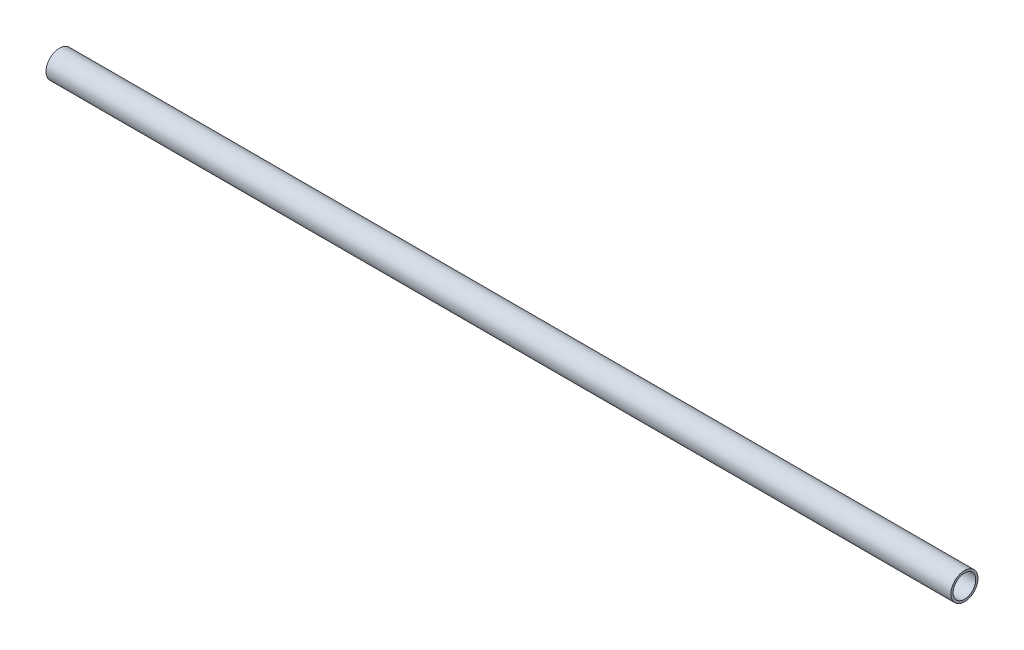
ISO-10303-21;
HEADER;
FILE_DESCRIPTION(('STEP AP214'),'2;1');
FILE_NAME('part.step','',(''),(''),'','','');
FILE_SCHEMA(('AUTOMOTIVE_DESIGN { 1 0 10303 214 1 1 1 1 }'));
ENDSEC;
DATA;
#1=APPLICATION_CONTEXT('core data for automotive mechanical design processes');
#2=APPLICATION_PROTOCOL_DEFINITION('international standard','automotive_design',2000,#1);
#3=PRODUCT_CONTEXT('',#1,'mechanical');
#4=PRODUCT('Part','Part','',(#3));
#5=PRODUCT_RELATED_PRODUCT_CATEGORY('part','',(#4));
#6=PRODUCT_DEFINITION_FORMATION('','',#4);
#7=PRODUCT_DEFINITION_CONTEXT('part definition',#1,'design');
#8=PRODUCT_DEFINITION('design','',#6,#7);
#9=PRODUCT_DEFINITION_SHAPE('','',#8);
#10=(LENGTH_UNIT() NAMED_UNIT(*) SI_UNIT(.MILLI.,.METRE.));
#11=(NAMED_UNIT(*) PLANE_ANGLE_UNIT() SI_UNIT($,.RADIAN.));
#12=(NAMED_UNIT(*) SI_UNIT($,.STERADIAN.) SOLID_ANGLE_UNIT());
#13=UNCERTAINTY_MEASURE_WITH_UNIT(LENGTH_MEASURE(1.E-05),#10,'distance_accuracy_value','');
#14=(GEOMETRIC_REPRESENTATION_CONTEXT(3) GLOBAL_UNCERTAINTY_ASSIGNED_CONTEXT((#13)) GLOBAL_UNIT_ASSIGNED_CONTEXT((#10,
#11,#12)) REPRESENTATION_CONTEXT('',''));
#15=CARTESIAN_POINT('',(0.,0.,0.));
#16=DIRECTION('',(0.,0.,1.));
#17=DIRECTION('',(1.,0.,0.));
#18=AXIS2_PLACEMENT_3D('',#15,#16,#17);
#19=CARTESIAN_POINT('',(-100.,5.,0.));
#20=DIRECTION('',(1.,0.,0.));
#21=DIRECTION('',(0.,0.,-1.));
#22=AXIS2_PLACEMENT_3D('',#19,#20,#21);
#23=PLANE('',#22);
#24=CARTESIAN_POINT('',(-100.,0.,0.));
#25=DIRECTION('',(-1.,0.,0.));
#26=DIRECTION('',(0.,0.,1.));
#27=AXIS2_PLACEMENT_3D('',#24,#25,#26);
#28=CIRCLE('',#27,5.);
#29=CARTESIAN_POINT('',(-100.,0.,5.));
#30=VERTEX_POINT('',#29);
#31=EDGE_CURVE('E54',#30,#30,#28,.T.);
#32=ORIENTED_EDGE('',*,*,#31,.F.);
#33=EDGE_LOOP('',(#32));
#34=FACE_BOUND('',#33,.T.);
#35=CARTESIAN_POINT('',(-100.,0.,0.));
#36=DIRECTION('',(-1.,0.,0.));
#37=DIRECTION('',(0.,0.,1.));
#38=AXIS2_PLACEMENT_3D('',#35,#36,#37);
#39=CIRCLE('',#38,6.);
#40=CARTESIAN_POINT('',(-100.,0.,6.));
#41=VERTEX_POINT('',#40);
#42=EDGE_CURVE('E10',#41,#41,#39,.T.);
#43=ORIENTED_EDGE('',*,*,#42,.T.);
#44=EDGE_LOOP('',(#43));
#45=FACE_BOUND('',#44,.T.);
#46=ADVANCED_FACE('F37',(#34,#45),#23,.F.);
#47=CARTESIAN_POINT('',(-74.1485760384701,0.,0.));
#48=DIRECTION('',(-1.,0.,0.));
#49=DIRECTION('',(0.,0.,1.));
#50=AXIS2_PLACEMENT_3D('',#47,#48,#49);
#51=CYLINDRICAL_SURFACE('',#50,6.);
#52=ORIENTED_EDGE('',*,*,#42,.F.);
#53=EDGE_LOOP('',(#52));
#54=FACE_BOUND('',#53,.T.);
#55=CARTESIAN_POINT('',(300.,0.,0.));
#56=DIRECTION('',(-1.,0.,0.));
#57=DIRECTION('',(0.,0.,1.));
#58=AXIS2_PLACEMENT_3D('',#55,#56,#57);
#59=CIRCLE('',#58,6.);
#60=CARTESIAN_POINT('',(300.,0.,6.));
#61=VERTEX_POINT('',#60);
#62=EDGE_CURVE('E44',#61,#61,#59,.T.);
#63=ORIENTED_EDGE('',*,*,#62,.T.);
#64=EDGE_LOOP('',(#63));
#65=FACE_BOUND('',#64,.T.);
#66=ADVANCED_FACE('F64',(#54,#65),#51,.T.);
#67=CARTESIAN_POINT('',(300.,5.,0.));
#68=DIRECTION('',(-1.,0.,0.));
#69=DIRECTION('',(0.,0.,1.));
#70=AXIS2_PLACEMENT_3D('',#67,#68,#69);
#71=PLANE('',#70);
#72=ORIENTED_EDGE('',*,*,#62,.F.);
#73=EDGE_LOOP('',(#72));
#74=FACE_BOUND('',#73,.T.);
#75=CARTESIAN_POINT('',(300.,0.,0.));
#76=DIRECTION('',(-1.,0.,0.));
#77=DIRECTION('',(0.,0.,1.));
#78=AXIS2_PLACEMENT_3D('',#75,#76,#77);
#79=CIRCLE('',#78,5.);
#80=CARTESIAN_POINT('',(300.,0.,5.));
#81=VERTEX_POINT('',#80);
#82=EDGE_CURVE('E49',#81,#81,#79,.T.);
#83=ORIENTED_EDGE('',*,*,#82,.T.);
#84=EDGE_LOOP('',(#83));
#85=FACE_BOUND('',#84,.T.);
#86=ADVANCED_FACE('F68',(#74,#85),#71,.F.);
#87=CARTESIAN_POINT('',(-74.1485760384701,0.,0.));
#88=DIRECTION('',(-1.,0.,0.));
#89=DIRECTION('',(0.,0.,1.));
#90=AXIS2_PLACEMENT_3D('',#87,#88,#89);
#91=CYLINDRICAL_SURFACE('',#90,5.);
#92=ORIENTED_EDGE('',*,*,#82,.F.);
#93=EDGE_LOOP('',(#92));
#94=FACE_BOUND('',#93,.T.);
#95=ORIENTED_EDGE('',*,*,#31,.T.);
#96=EDGE_LOOP('',(#95));
#97=FACE_BOUND('',#96,.T.);
#98=ADVANCED_FACE('F61',(#94,#97),#91,.F.);
#99=CLOSED_SHELL('',(#46,#66,#86,#98));
#100=MANIFOLD_SOLID_BREP('B2',#99);
#101=ADVANCED_BREP_SHAPE_REPRESENTATION('',(#18,#100),#14);
#102=SHAPE_DEFINITION_REPRESENTATION(#9,#101);
ENDSEC;
END-ISO-10303-21;
